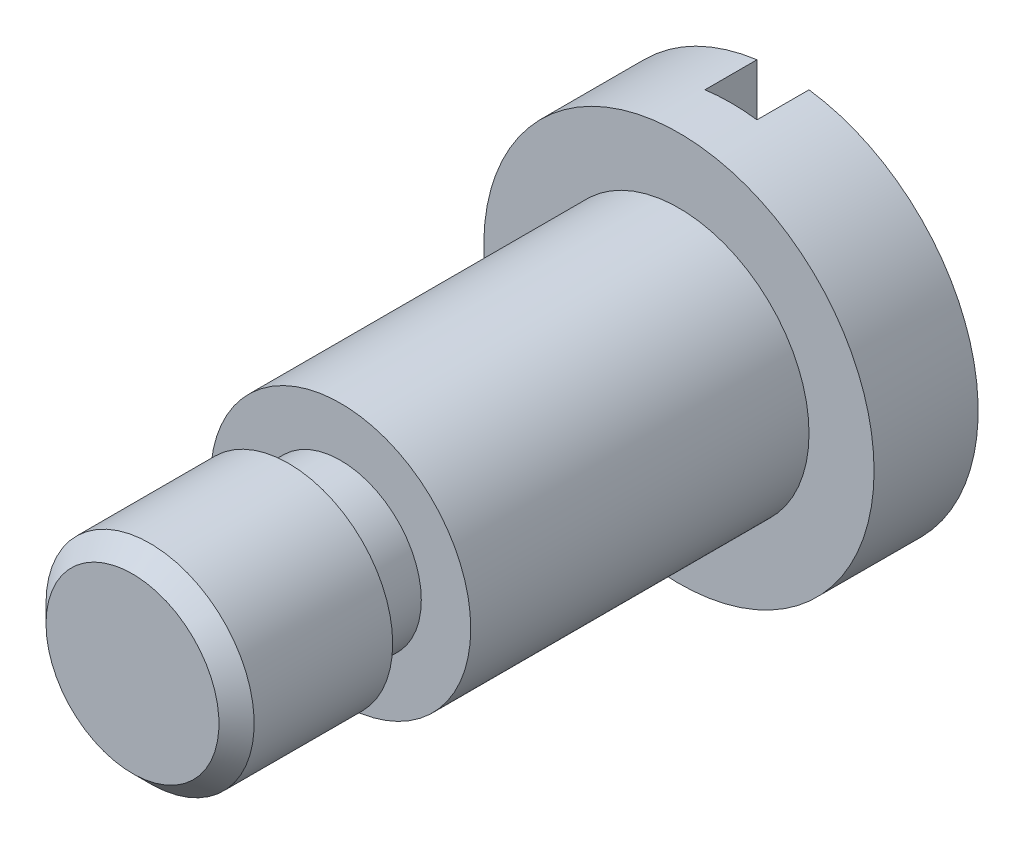
ISO-10303-21;
HEADER;
FILE_DESCRIPTION(('STEP AP214'),'2;1');
FILE_NAME('part.step','',(''),(''),'','','');
FILE_SCHEMA(('AUTOMOTIVE_DESIGN { 1 0 10303 214 1 1 1 1 }'));
ENDSEC;
DATA;
#1=APPLICATION_CONTEXT('core data for automotive mechanical design processes');
#2=APPLICATION_PROTOCOL_DEFINITION('international standard','automotive_design',2000,#1);
#3=PRODUCT_CONTEXT('',#1,'mechanical');
#4=PRODUCT('Part','Part','',(#3));
#5=PRODUCT_RELATED_PRODUCT_CATEGORY('part','',(#4));
#6=PRODUCT_DEFINITION_FORMATION('','',#4);
#7=PRODUCT_DEFINITION_CONTEXT('part definition',#1,'design');
#8=PRODUCT_DEFINITION('design','',#6,#7);
#9=PRODUCT_DEFINITION_SHAPE('','',#8);
#10=(LENGTH_UNIT() NAMED_UNIT(*) SI_UNIT(.MILLI.,.METRE.));
#11=(NAMED_UNIT(*) PLANE_ANGLE_UNIT() SI_UNIT($,.RADIAN.));
#12=(NAMED_UNIT(*) SI_UNIT($,.STERADIAN.) SOLID_ANGLE_UNIT());
#13=UNCERTAINTY_MEASURE_WITH_UNIT(LENGTH_MEASURE(1.E-05),#10,'distance_accuracy_value','');
#14=(GEOMETRIC_REPRESENTATION_CONTEXT(3) GLOBAL_UNCERTAINTY_ASSIGNED_CONTEXT((#13)) GLOBAL_UNIT_ASSIGNED_CONTEXT((#10,
#11,#12)) REPRESENTATION_CONTEXT('',''));
#15=CARTESIAN_POINT('',(0.,0.,0.));
#16=DIRECTION('',(0.,0.,1.));
#17=DIRECTION('',(1.,0.,0.));
#18=AXIS2_PLACEMENT_3D('',#15,#16,#17);
#19=CARTESIAN_POINT('',(0.,0.,0.));
#20=DIRECTION('',(0.,0.,1.));
#21=DIRECTION('',(1.,0.,0.));
#22=AXIS2_PLACEMENT_3D('',#19,#20,#21);
#23=PLANE('',#22);
#24=DIRECTION('',(0.,-1.,0.));
#25=VECTOR('',#24,1.);
#26=CARTESIAN_POINT('',(1.,0.,0.));
#27=LINE('',#26,#25);
#28=CARTESIAN_POINT('',(1.,7.43303437365925,0.));
#29=VERTEX_POINT('',#28);
#30=CARTESIAN_POINT('',(1.,-7.43303437365925,0.));
#31=VERTEX_POINT('',#30);
#32=EDGE_CURVE('E83',#29,#31,#27,.T.);
#33=ORIENTED_EDGE('',*,*,#32,.F.);
#34=CARTESIAN_POINT('',(0.,0.,0.));
#35=DIRECTION('',(0.,0.,1.));
#36=DIRECTION('',(1.,0.,0.));
#37=AXIS2_PLACEMENT_3D('',#34,#35,#36);
#38=CIRCLE('',#37,7.5);
#39=EDGE_CURVE('E97',#31,#29,#38,.T.);
#40=ORIENTED_EDGE('',*,*,#39,.F.);
#41=EDGE_LOOP('',(#33,#40));
#42=FACE_BOUND('',#41,.T.);
#43=ADVANCED_FACE('F43',(#42),#23,.F.);
#44=CARTESIAN_POINT('',(0.,0.,4.));
#45=DIRECTION('',(0.,0.,-1.));
#46=DIRECTION('',(-1.,0.,0.));
#47=AXIS2_PLACEMENT_3D('',#44,#45,#46);
#48=CYLINDRICAL_SURFACE('',#47,7.5);
#49=CARTESIAN_POINT('',(0.,0.,2.));
#50=DIRECTION('',(0.,0.,1.));
#51=DIRECTION('',(1.,0.,0.));
#52=AXIS2_PLACEMENT_3D('',#49,#50,#51);
#53=CIRCLE('',#52,7.5);
#54=CARTESIAN_POINT('',(1.,7.43303437365925,2.));
#55=VERTEX_POINT('',#54);
#56=CARTESIAN_POINT('',(-1.,7.43303437365925,2.));
#57=VERTEX_POINT('',#56);
#58=EDGE_CURVE('E11',#55,#57,#53,.T.);
#59=ORIENTED_EDGE('',*,*,#58,.T.);
#60=DIRECTION('',(0.,0.,-1.));
#61=VECTOR('',#60,1.);
#62=CARTESIAN_POINT('',(-1.,7.43303437365925,4.));
#63=LINE('',#62,#61);
#64=CARTESIAN_POINT('',(-1.,7.43303437365925,0.));
#65=VERTEX_POINT('',#64);
#66=EDGE_CURVE('E66',#57,#65,#63,.T.);
#67=ORIENTED_EDGE('',*,*,#66,.T.);
#68=CARTESIAN_POINT('',(-1.,-7.43303437365925,0.));
#69=VERTEX_POINT('',#68);
#70=EDGE_CURVE('E101',#65,#69,#38,.T.);
#71=ORIENTED_EDGE('',*,*,#70,.T.);
#72=DIRECTION('',(0.,0.,-1.));
#73=VECTOR('',#72,1.);
#74=CARTESIAN_POINT('',(-1.,-7.43303437365925,4.));
#75=LINE('',#74,#73);
#76=CARTESIAN_POINT('',(-1.,-7.43303437365925,2.));
#77=VERTEX_POINT('',#76);
#78=EDGE_CURVE('E115',#69,#77,#75,.F.);
#79=ORIENTED_EDGE('',*,*,#78,.T.);
#80=CARTESIAN_POINT('',(1.,-7.43303437365925,2.));
#81=VERTEX_POINT('',#80);
#82=EDGE_CURVE('E47',#77,#81,#53,.T.);
#83=ORIENTED_EDGE('',*,*,#82,.T.);
#84=DIRECTION('',(0.,0.,-1.));
#85=VECTOR('',#84,1.);
#86=CARTESIAN_POINT('',(1.,-7.43303437365925,4.));
#87=LINE('',#86,#85);
#88=EDGE_CURVE('E86',#31,#81,#87,.F.);
#89=ORIENTED_EDGE('',*,*,#88,.F.);
#90=ORIENTED_EDGE('',*,*,#39,.T.);
#91=DIRECTION('',(0.,0.,-1.));
#92=VECTOR('',#91,1.);
#93=CARTESIAN_POINT('',(1.,7.43303437365925,4.));
#94=LINE('',#93,#92);
#95=EDGE_CURVE('E58',#55,#29,#94,.T.);
#96=ORIENTED_EDGE('',*,*,#95,.F.);
#97=EDGE_LOOP('',(#59,#67,#71,#79,#83,#89,#90,#96));
#98=FACE_BOUND('',#97,.T.);
#99=CARTESIAN_POINT('',(0.,0.,4.));
#100=DIRECTION('',(0.,0.,1.));
#101=DIRECTION('',(1.,0.,0.));
#102=AXIS2_PLACEMENT_3D('',#99,#100,#101);
#103=CIRCLE('',#102,7.5);
#104=CARTESIAN_POINT('',(7.5,0.,4.));
#105=VERTEX_POINT('',#104);
#106=EDGE_CURVE('E105',#105,#105,#103,.T.);
#107=ORIENTED_EDGE('',*,*,#106,.F.);
#108=EDGE_LOOP('',(#107));
#109=FACE_BOUND('',#108,.T.);
#110=ADVANCED_FACE('F45',(#98,#109),#48,.T.);
#111=CARTESIAN_POINT('',(0.,0.,4.));
#112=DIRECTION('',(0.,0.,1.));
#113=DIRECTION('',(1.,0.,0.));
#114=AXIS2_PLACEMENT_3D('',#111,#112,#113);
#115=PLANE('',#114);
#116=CARTESIAN_POINT('',(0.,0.,4.));
#117=DIRECTION('',(0.,0.,1.));
#118=DIRECTION('',(1.,0.,0.));
#119=AXIS2_PLACEMENT_3D('',#116,#117,#118);
#120=CIRCLE('',#119,5.);
#121=CARTESIAN_POINT('',(-5.,0.,4.));
#122=VERTEX_POINT('',#121);
#123=EDGE_CURVE('E132',#122,#122,#120,.T.);
#124=ORIENTED_EDGE('',*,*,#123,.F.);
#125=EDGE_LOOP('',(#124));
#126=FACE_BOUND('',#125,.T.);
#127=ORIENTED_EDGE('',*,*,#106,.T.);
#128=EDGE_LOOP('',(#127));
#129=FACE_BOUND('',#128,.T.);
#130=ADVANCED_FACE('F139',(#126,#129),#115,.T.);
#131=ORIENTED_EDGE('',*,*,#70,.F.);
#132=DIRECTION('',(0.,-1.,0.));
#133=VECTOR('',#132,1.);
#134=CARTESIAN_POINT('',(-1.,0.,0.));
#135=LINE('',#134,#133);
#136=EDGE_CURVE('E91',#65,#69,#135,.T.);
#137=ORIENTED_EDGE('',*,*,#136,.T.);
#138=EDGE_LOOP('',(#131,#137));
#139=FACE_BOUND('',#138,.T.);
#140=ADVANCED_FACE('F114',(#139),#23,.F.);
#141=CARTESIAN_POINT('',(0.,0.,17.));
#142=DIRECTION('',(0.,0.,-1.));
#143=DIRECTION('',(-1.,0.,0.));
#144=AXIS2_PLACEMENT_3D('',#141,#142,#143);
#145=CYLINDRICAL_SURFACE('',#144,5.);
#146=CARTESIAN_POINT('',(0.,0.,17.));
#147=DIRECTION('',(0.,0.,1.));
#148=DIRECTION('',(1.,0.,0.));
#149=AXIS2_PLACEMENT_3D('',#146,#147,#148);
#150=CIRCLE('',#149,5.);
#151=CARTESIAN_POINT('',(-5.,0.,17.));
#152=VERTEX_POINT('',#151);
#153=EDGE_CURVE('E102',#152,#152,#150,.T.);
#154=CARTESIAN_POINT('',(-5.,0.,17.));
#155=CARTESIAN_POINT('',(-5.,0.,16.8645833333333));
#156=CARTESIAN_POINT('',(-5.,0.,16.7291666666667));
#157=CARTESIAN_POINT('',(-5.,0.,16.4583333333333));
#158=CARTESIAN_POINT('',(-5.,0.,16.3229166666667));
#159=CARTESIAN_POINT('',(-5.,0.,16.0520833333333));
#160=CARTESIAN_POINT('',(-5.,0.,15.9166666666667));
#161=CARTESIAN_POINT('',(-5.,0.,15.6458333333333));
#162=CARTESIAN_POINT('',(-5.,0.,15.5104166666667));
#163=CARTESIAN_POINT('',(-5.,0.,15.2395833333333));
#164=CARTESIAN_POINT('',(-5.,0.,15.1041666666667));
#165=CARTESIAN_POINT('',(-5.,0.,14.8333333333333));
#166=CARTESIAN_POINT('',(-5.,0.,14.6979166666667));
#167=CARTESIAN_POINT('',(-5.,0.,14.4270833333333));
#168=CARTESIAN_POINT('',(-5.,0.,14.2916666666667));
#169=CARTESIAN_POINT('',(-5.,0.,14.0208333333333));
#170=CARTESIAN_POINT('',(-5.,0.,13.8854166666667));
#171=CARTESIAN_POINT('',(-5.,0.,13.6145833333333));
#172=CARTESIAN_POINT('',(-5.,0.,13.4791666666667));
#173=CARTESIAN_POINT('',(-5.,0.,13.2083333333333));
#174=CARTESIAN_POINT('',(-5.,0.,13.0729166666667));
#175=CARTESIAN_POINT('',(-5.,0.,12.8020833333333));
#176=CARTESIAN_POINT('',(-5.,0.,12.6666666666667));
#177=CARTESIAN_POINT('',(-5.,0.,12.3958333333333));
#178=CARTESIAN_POINT('',(-5.,0.,12.2604166666667));
#179=CARTESIAN_POINT('',(-5.,0.,11.9895833333333));
#180=CARTESIAN_POINT('',(-5.,0.,11.8541666666667));
#181=CARTESIAN_POINT('',(-5.,0.,11.5833333333333));
#182=CARTESIAN_POINT('',(-5.,0.,11.4479166666667));
#183=CARTESIAN_POINT('',(-5.,0.,11.1770833333333));
#184=CARTESIAN_POINT('',(-5.,0.,11.0416666666667));
#185=CARTESIAN_POINT('',(-5.,0.,10.7708333333333));
#186=CARTESIAN_POINT('',(-5.,0.,10.6354166666667));
#187=CARTESIAN_POINT('',(-5.,0.,10.3645833333333));
#188=CARTESIAN_POINT('',(-5.,0.,10.2291666666667));
#189=CARTESIAN_POINT('',(-5.,0.,9.95833333333333));
#190=CARTESIAN_POINT('',(-5.,0.,9.82291666666667));
#191=CARTESIAN_POINT('',(-5.,0.,9.55208333333333));
#192=CARTESIAN_POINT('',(-5.,0.,9.41666666666667));
#193=CARTESIAN_POINT('',(-5.,0.,9.14583333333333));
#194=CARTESIAN_POINT('',(-5.,0.,9.01041666666666));
#195=CARTESIAN_POINT('',(-5.,0.,8.73958333333333));
#196=CARTESIAN_POINT('',(-5.,0.,8.60416666666667));
#197=CARTESIAN_POINT('',(-5.,0.,8.33333333333333));
#198=CARTESIAN_POINT('',(-5.,0.,8.19791666666667));
#199=CARTESIAN_POINT('',(-5.,0.,7.92708333333333));
#200=CARTESIAN_POINT('',(-5.,0.,7.79166666666667));
#201=CARTESIAN_POINT('',(-5.,0.,7.52083333333333));
#202=CARTESIAN_POINT('',(-5.,0.,7.38541666666667));
#203=CARTESIAN_POINT('',(-5.,0.,7.11458333333333));
#204=CARTESIAN_POINT('',(-5.,0.,6.97916666666667));
#205=CARTESIAN_POINT('',(-5.,0.,6.70833333333333));
#206=CARTESIAN_POINT('',(-5.,0.,6.57291666666667));
#207=CARTESIAN_POINT('',(-5.,0.,6.30208333333333));
#208=CARTESIAN_POINT('',(-5.,0.,6.16666666666667));
#209=CARTESIAN_POINT('',(-5.,0.,5.89583333333333));
#210=CARTESIAN_POINT('',(-5.,0.,5.76041666666666));
#211=CARTESIAN_POINT('',(-5.,0.,5.48958333333333));
#212=CARTESIAN_POINT('',(-5.,0.,5.35416666666667));
#213=CARTESIAN_POINT('',(-5.,0.,5.08333333333333));
#214=CARTESIAN_POINT('',(-5.,0.,4.94791666666667));
#215=CARTESIAN_POINT('',(-5.,0.,4.67708333333333));
#216=CARTESIAN_POINT('',(-5.,0.,4.54166666666667));
#217=CARTESIAN_POINT('',(-5.,0.,4.27083333333333));
#218=CARTESIAN_POINT('',(-5.,0.,4.13541666666667));
#219=CARTESIAN_POINT('',(-5.,0.,4.));
#220=B_SPLINE_CURVE_WITH_KNOTS('',3,(#154,#155,#156,#157,#158,#159,#160,#161,#162,#163,#164,
#165,#166,#167,#168,#169,#170,#171,#172,#173,#174,#175,#176,#177,#178,#179,#180,#181,#182,#183,
#184,#185,#186,#187,#188,#189,#190,#191,#192,#193,#194,#195,#196,#197,#198,#199,#200,#201,#202,
#203,#204,#205,#206,#207,#208,#209,#210,#211,#212,#213,#214,#215,#216,#217,#218,#219),
.UNSPECIFIED.,.F.,.F.,(4,2,2,2,2,2,2,2,2,2,2,2,2,2,2,2,2,2,2,2,2,2,2,2,2,2,2,2,2,2,2,2,4),(0.,
0.40625,0.812500000000001,1.21875,1.625,2.03125,2.4375,2.84375,3.25,3.65625,4.0625,4.46875,
4.875,5.28125,5.6875,6.09375,6.5,6.90625,7.3125,7.71875,8.125,8.53125,8.9375,9.34375,9.75,
10.15625,10.5625,10.96875,11.375,11.78125,12.1875,12.59375,13.),.UNSPECIFIED.);
#221=EDGE_CURVE('BSEAM151',#152,#122,#220,.T.);
#222=ORIENTED_EDGE('',*,*,#153,.F.);
#223=ORIENTED_EDGE('',*,*,#123,.T.);
#224=ORIENTED_EDGE('',*,*,#221,.T.);
#225=ORIENTED_EDGE('',*,*,#221,.F.);
#226=EDGE_LOOP('',(#222,#224,#223,#225));
#227=FACE_BOUND('',#226,.T.);
#228=ADVANCED_FACE('F151',(#227),#145,.T.);
#229=CARTESIAN_POINT('',(0.,0.,17.));
#230=DIRECTION('',(0.,0.,1.));
#231=DIRECTION('',(1.,0.,0.));
#232=AXIS2_PLACEMENT_3D('',#229,#230,#231);
#233=PLANE('',#232);
#234=CARTESIAN_POINT('',(0.,0.,17.));
#235=DIRECTION('',(0.,0.,1.));
#236=DIRECTION('',(1.,0.,0.));
#237=AXIS2_PLACEMENT_3D('',#234,#235,#236);
#238=CIRCLE('',#237,3.1);
#239=CARTESIAN_POINT('',(3.1,0.,17.));
#240=VERTEX_POINT('',#239);
#241=EDGE_CURVE('E92',#240,#240,#238,.T.);
#242=ORIENTED_EDGE('',*,*,#241,.F.);
#243=EDGE_LOOP('',(#242));
#244=FACE_BOUND('',#243,.T.);
#245=ORIENTED_EDGE('',*,*,#153,.T.);
#246=EDGE_LOOP('',(#245));
#247=FACE_BOUND('',#246,.T.);
#248=ADVANCED_FACE('F156',(#244,#247),#233,.T.);
#249=CARTESIAN_POINT('',(0.,0.,19.));
#250=DIRECTION('',(0.,0.,-1.));
#251=DIRECTION('',(-1.,0.,0.));
#252=AXIS2_PLACEMENT_3D('',#249,#250,#251);
#253=CYLINDRICAL_SURFACE('',#252,3.1);
#254=CARTESIAN_POINT('',(0.,0.,19.));
#255=DIRECTION('',(0.,0.,1.));
#256=DIRECTION('',(1.,0.,0.));
#257=AXIS2_PLACEMENT_3D('',#254,#255,#256);
#258=CIRCLE('',#257,3.1);
#259=CARTESIAN_POINT('',(3.1,0.,19.));
#260=VERTEX_POINT('',#259);
#261=EDGE_CURVE('E107',#260,#260,#258,.T.);
#262=ORIENTED_EDGE('',*,*,#261,.F.);
#263=EDGE_LOOP('',(#262));
#264=FACE_BOUND('',#263,.T.);
#265=ORIENTED_EDGE('',*,*,#241,.T.);
#266=EDGE_LOOP('',(#265));
#267=FACE_BOUND('',#266,.T.);
#268=ADVANCED_FACE('F162',(#264,#267),#253,.T.);
#269=CARTESIAN_POINT('',(0.,0.,25.));
#270=DIRECTION('',(0.,0.,-1.));
#271=DIRECTION('',(-1.,0.,0.));
#272=AXIS2_PLACEMENT_3D('',#269,#270,#271);
#273=CYLINDRICAL_SURFACE('',#272,4.);
#274=CARTESIAN_POINT('',(0.,0.,24.3235));
#275=DIRECTION('',(0.,0.,-1.));
#276=DIRECTION('',(-1.,0.,0.));
#277=AXIS2_PLACEMENT_3D('',#274,#275,#276);
#278=CIRCLE('',#277,4.);
#279=CARTESIAN_POINT('',(-4.,0.,24.3235));
#280=VERTEX_POINT('',#279);
#281=EDGE_CURVE('E119',#280,#280,#278,.T.);
#282=ORIENTED_EDGE('',*,*,#281,.T.);
#283=EDGE_LOOP('',(#282));
#284=FACE_BOUND('',#283,.T.);
#285=CARTESIAN_POINT('',(0.,0.,19.));
#286=DIRECTION('',(0.,0.,1.));
#287=DIRECTION('',(1.,0.,0.));
#288=AXIS2_PLACEMENT_3D('',#285,#286,#287);
#289=CIRCLE('',#288,4.);
#290=CARTESIAN_POINT('',(4.,0.,19.));
#291=VERTEX_POINT('',#290);
#292=EDGE_CURVE('E126',#291,#291,#289,.T.);
#293=ORIENTED_EDGE('',*,*,#292,.T.);
#294=EDGE_LOOP('',(#293));
#295=FACE_BOUND('',#294,.T.);
#296=ADVANCED_FACE('F169',(#284,#295),#273,.T.);
#297=CARTESIAN_POINT('',(0.,0.,19.));
#298=DIRECTION('',(0.,0.,1.));
#299=DIRECTION('',(1.,0.,0.));
#300=AXIS2_PLACEMENT_3D('',#297,#298,#299);
#301=PLANE('',#300);
#302=ORIENTED_EDGE('',*,*,#261,.T.);
#303=EDGE_LOOP('',(#302));
#304=FACE_BOUND('',#303,.T.);
#305=ORIENTED_EDGE('',*,*,#292,.F.);
#306=EDGE_LOOP('',(#305));
#307=FACE_BOUND('',#306,.T.);
#308=ADVANCED_FACE('F173',(#304,#307),#301,.F.);
#309=CARTESIAN_POINT('',(0.,0.,25.));
#310=DIRECTION('',(0.,0.,-1.));
#311=DIRECTION('',(-1.,0.,0.));
#312=AXIS2_PLACEMENT_3D('',#309,#310,#311);
#313=CONICAL_SURFACE('',#312,3.3235,0.785398163397453);
#314=ORIENTED_EDGE('',*,*,#281,.F.);
#315=EDGE_LOOP('',(#314));
#316=FACE_BOUND('',#315,.T.);
#317=CARTESIAN_POINT('',(0.,0.,25.));
#318=DIRECTION('',(0.,0.,-1.));
#319=DIRECTION('',(-1.,0.,0.));
#320=AXIS2_PLACEMENT_3D('',#317,#318,#319);
#321=CIRCLE('',#320,3.3235);
#322=CARTESIAN_POINT('',(-3.3235,0.,25.));
#323=VERTEX_POINT('',#322);
#324=EDGE_CURVE('E116',#323,#323,#321,.T.);
#325=ORIENTED_EDGE('',*,*,#324,.T.);
#326=EDGE_LOOP('',(#325));
#327=FACE_BOUND('',#326,.T.);
#328=ADVANCED_FACE('F177',(#316,#327),#313,.T.);
#329=CARTESIAN_POINT('',(0.,0.,25.));
#330=DIRECTION('',(0.,0.,1.));
#331=DIRECTION('',(1.,0.,0.));
#332=AXIS2_PLACEMENT_3D('',#329,#330,#331);
#333=PLANE('',#332);
#334=ORIENTED_EDGE('',*,*,#324,.F.);
#335=EDGE_LOOP('',(#334));
#336=FACE_BOUND('',#335,.T.);
#337=ADVANCED_FACE('F179',(#336),#333,.T.);
#338=CARTESIAN_POINT('',(0.,0.,2.));
#339=DIRECTION('',(0.,0.,1.));
#340=DIRECTION('',(1.,0.,0.));
#341=AXIS2_PLACEMENT_3D('',#338,#339,#340);
#342=PLANE('',#341);
#343=DIRECTION('',(0.,1.,0.));
#344=VECTOR('',#343,1.);
#345=CARTESIAN_POINT('',(1.,-7.94050713309716,2.));
#346=LINE('',#345,#344);
#347=EDGE_CURVE('E99',#81,#55,#346,.T.);
#348=ORIENTED_EDGE('',*,*,#347,.F.);
#349=ORIENTED_EDGE('',*,*,#82,.F.);
#350=DIRECTION('',(0.,1.,0.));
#351=VECTOR('',#350,1.);
#352=CARTESIAN_POINT('',(-1.,-7.94050713309716,2.));
#353=LINE('',#352,#351);
#354=EDGE_CURVE('E194',#77,#57,#353,.T.);
#355=ORIENTED_EDGE('',*,*,#354,.T.);
#356=ORIENTED_EDGE('',*,*,#58,.F.);
#357=EDGE_LOOP('',(#348,#349,#355,#356));
#358=FACE_BOUND('',#357,.T.);
#359=ADVANCED_FACE('F181',(#358),#342,.F.);
#360=CARTESIAN_POINT('',(-1.,-7.94050713309716,2.));
#361=DIRECTION('',(-1.,0.,0.));
#362=DIRECTION('',(0.,0.,1.));
#363=AXIS2_PLACEMENT_3D('',#360,#361,#362);
#364=PLANE('',#363);
#365=ORIENTED_EDGE('',*,*,#354,.F.);
#366=ORIENTED_EDGE('',*,*,#78,.F.);
#367=ORIENTED_EDGE('',*,*,#136,.F.);
#368=ORIENTED_EDGE('',*,*,#66,.F.);
#369=EDGE_LOOP('',(#365,#366,#367,#368));
#370=FACE_BOUND('',#369,.T.);
#371=ADVANCED_FACE('F186',(#370),#364,.F.);
#372=CARTESIAN_POINT('',(1.,-7.94050713309716,2.));
#373=DIRECTION('',(-1.,0.,0.));
#374=DIRECTION('',(0.,0.,1.));
#375=AXIS2_PLACEMENT_3D('',#372,#373,#374);
#376=PLANE('',#375);
#377=ORIENTED_EDGE('',*,*,#95,.T.);
#378=ORIENTED_EDGE('',*,*,#32,.T.);
#379=ORIENTED_EDGE('',*,*,#88,.T.);
#380=ORIENTED_EDGE('',*,*,#347,.T.);
#381=EDGE_LOOP('',(#377,#378,#379,#380));
#382=FACE_BOUND('',#381,.T.);
#383=ADVANCED_FACE('F85',(#382),#376,.T.);
#384=CLOSED_SHELL('',(#43,#110,#130,#140,#228,#248,#268,#296,#308,#328,#337,#359,#371,#383));
#385=MANIFOLD_SOLID_BREP('B2',#384);
#386=ADVANCED_BREP_SHAPE_REPRESENTATION('',(#18,#385),#14);
#387=SHAPE_DEFINITION_REPRESENTATION(#9,#386);
ENDSEC;
END-ISO-10303-21;
